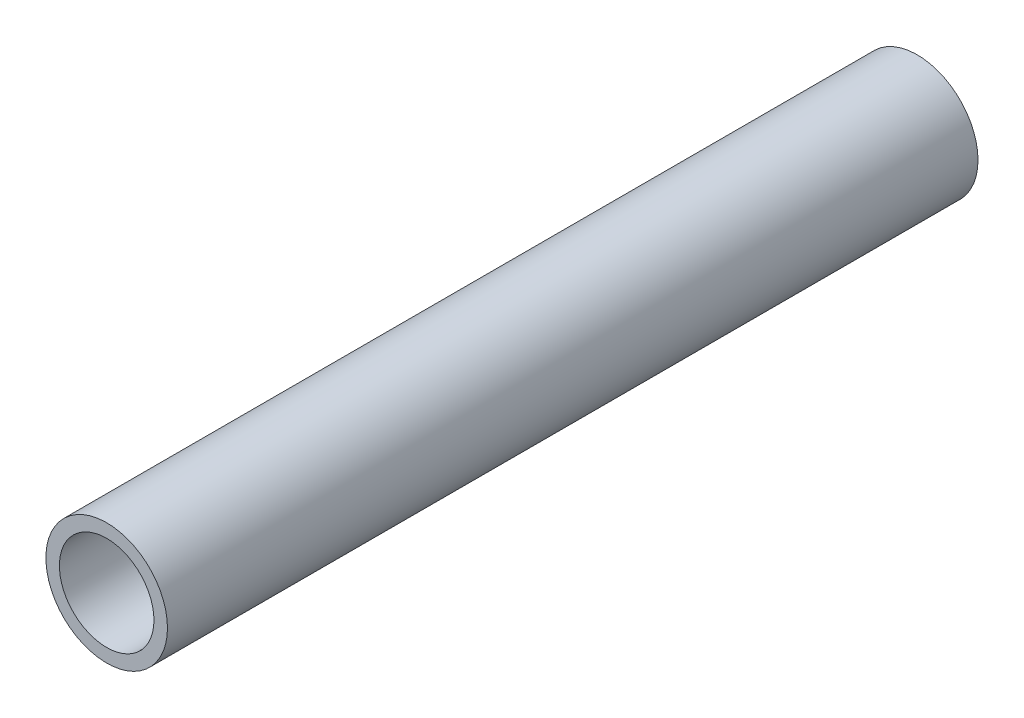
ISO-10303-21;
HEADER;
FILE_DESCRIPTION(('STEP AP214'),'2;1');
FILE_NAME('part.step','',(''),(''),'','','');
FILE_SCHEMA(('AUTOMOTIVE_DESIGN { 1 0 10303 214 1 1 1 1 }'));
ENDSEC;
DATA;
#1=APPLICATION_CONTEXT('core data for automotive mechanical design processes');
#2=APPLICATION_PROTOCOL_DEFINITION('international standard','automotive_design',2000,#1);
#3=PRODUCT_CONTEXT('',#1,'mechanical');
#4=PRODUCT('Part','Part','',(#3));
#5=PRODUCT_RELATED_PRODUCT_CATEGORY('part','',(#4));
#6=PRODUCT_DEFINITION_FORMATION('','',#4);
#7=PRODUCT_DEFINITION_CONTEXT('part definition',#1,'design');
#8=PRODUCT_DEFINITION('design','',#6,#7);
#9=PRODUCT_DEFINITION_SHAPE('','',#8);
#10=(LENGTH_UNIT() NAMED_UNIT(*) SI_UNIT(.MILLI.,.METRE.));
#11=(NAMED_UNIT(*) PLANE_ANGLE_UNIT() SI_UNIT($,.RADIAN.));
#12=(NAMED_UNIT(*) SI_UNIT($,.STERADIAN.) SOLID_ANGLE_UNIT());
#13=UNCERTAINTY_MEASURE_WITH_UNIT(LENGTH_MEASURE(1.E-05),#10,'distance_accuracy_value','');
#14=(GEOMETRIC_REPRESENTATION_CONTEXT(3) GLOBAL_UNCERTAINTY_ASSIGNED_CONTEXT((#13)) GLOBAL_UNIT_ASSIGNED_CONTEXT((#10,
#11,#12)) REPRESENTATION_CONTEXT('',''));
#15=CARTESIAN_POINT('',(0.,0.,0.));
#16=DIRECTION('',(0.,0.,1.));
#17=DIRECTION('',(1.,0.,0.));
#18=AXIS2_PLACEMENT_3D('',#15,#16,#17);
#19=CARTESIAN_POINT('',(0.,0.,60.));
#20=DIRECTION('',(0.,0.,1.));
#21=DIRECTION('',(1.,0.,0.));
#22=AXIS2_PLACEMENT_3D('',#19,#20,#21);
#23=PLANE('',#22);
#24=CARTESIAN_POINT('',(0.,0.,60.));
#25=DIRECTION('',(0.,0.,1.));
#26=DIRECTION('',(1.,0.,0.));
#27=AXIS2_PLACEMENT_3D('',#24,#25,#26);
#28=CIRCLE('',#27,4.5);
#29=CARTESIAN_POINT('',(4.5,0.,60.));
#30=VERTEX_POINT('',#29);
#31=EDGE_CURVE('E10',#30,#30,#28,.T.);
#32=ORIENTED_EDGE('',*,*,#31,.T.);
#33=EDGE_LOOP('',(#32));
#34=FACE_BOUND('',#33,.T.);
#35=CARTESIAN_POINT('',(0.,0.,60.));
#36=DIRECTION('',(0.,0.,1.));
#37=DIRECTION('',(1.,0.,0.));
#38=AXIS2_PLACEMENT_3D('',#35,#36,#37);
#39=CIRCLE('',#38,3.5);
#40=CARTESIAN_POINT('',(3.5,0.,60.));
#41=VERTEX_POINT('',#40);
#42=EDGE_CURVE('E40',#41,#41,#39,.T.);
#43=ORIENTED_EDGE('',*,*,#42,.F.);
#44=EDGE_LOOP('',(#43));
#45=FACE_BOUND('',#44,.T.);
#46=ADVANCED_FACE('F29',(#34,#45),#23,.T.);
#47=CARTESIAN_POINT('',(0.,0.,0.));
#48=DIRECTION('',(0.,0.,1.));
#49=DIRECTION('',(1.,0.,0.));
#50=AXIS2_PLACEMENT_3D('',#47,#48,#49);
#51=PLANE('',#50);
#52=CARTESIAN_POINT('',(0.,0.,0.));
#53=DIRECTION('',(0.,0.,1.));
#54=DIRECTION('',(1.,0.,0.));
#55=AXIS2_PLACEMENT_3D('',#52,#53,#54);
#56=CIRCLE('',#55,4.5);
#57=CARTESIAN_POINT('',(4.5,0.,0.));
#58=VERTEX_POINT('',#57);
#59=EDGE_CURVE('E33',#58,#58,#56,.T.);
#60=ORIENTED_EDGE('',*,*,#59,.F.);
#61=EDGE_LOOP('',(#60));
#62=FACE_BOUND('',#61,.T.);
#63=CARTESIAN_POINT('',(0.,0.,0.));
#64=DIRECTION('',(0.,0.,1.));
#65=DIRECTION('',(1.,0.,0.));
#66=AXIS2_PLACEMENT_3D('',#63,#64,#65);
#67=CIRCLE('',#66,3.5);
#68=CARTESIAN_POINT('',(3.5,0.,0.));
#69=VERTEX_POINT('',#68);
#70=EDGE_CURVE('E42',#69,#69,#67,.T.);
#71=ORIENTED_EDGE('',*,*,#70,.T.);
#72=EDGE_LOOP('',(#71));
#73=FACE_BOUND('',#72,.T.);
#74=ADVANCED_FACE('F52',(#62,#73),#51,.F.);
#75=CARTESIAN_POINT('',(0.,0.,60.));
#76=DIRECTION('',(0.,0.,-1.));
#77=DIRECTION('',(-1.,0.,0.));
#78=AXIS2_PLACEMENT_3D('',#75,#76,#77);
#79=CYLINDRICAL_SURFACE('',#78,4.5);
#80=ORIENTED_EDGE('',*,*,#31,.F.);
#81=EDGE_LOOP('',(#80));
#82=FACE_BOUND('',#81,.T.);
#83=ORIENTED_EDGE('',*,*,#59,.T.);
#84=EDGE_LOOP('',(#83));
#85=FACE_BOUND('',#84,.T.);
#86=ADVANCED_FACE('F31',(#82,#85),#79,.T.);
#87=CARTESIAN_POINT('',(0.,0.,60.));
#88=DIRECTION('',(0.,0.,-1.));
#89=DIRECTION('',(-1.,0.,0.));
#90=AXIS2_PLACEMENT_3D('',#87,#88,#89);
#91=CYLINDRICAL_SURFACE('',#90,3.5);
#92=ORIENTED_EDGE('',*,*,#42,.T.);
#93=EDGE_LOOP('',(#92));
#94=FACE_BOUND('',#93,.T.);
#95=ORIENTED_EDGE('',*,*,#70,.F.);
#96=EDGE_LOOP('',(#95));
#97=FACE_BOUND('',#96,.T.);
#98=ADVANCED_FACE('F48',(#94,#97),#91,.F.);
#99=CLOSED_SHELL('',(#46,#74,#86,#98));
#100=MANIFOLD_SOLID_BREP('B2',#99);
#101=ADVANCED_BREP_SHAPE_REPRESENTATION('',(#18,#100),#14);
#102=SHAPE_DEFINITION_REPRESENTATION(#9,#101);
ENDSEC;
END-ISO-10303-21;
